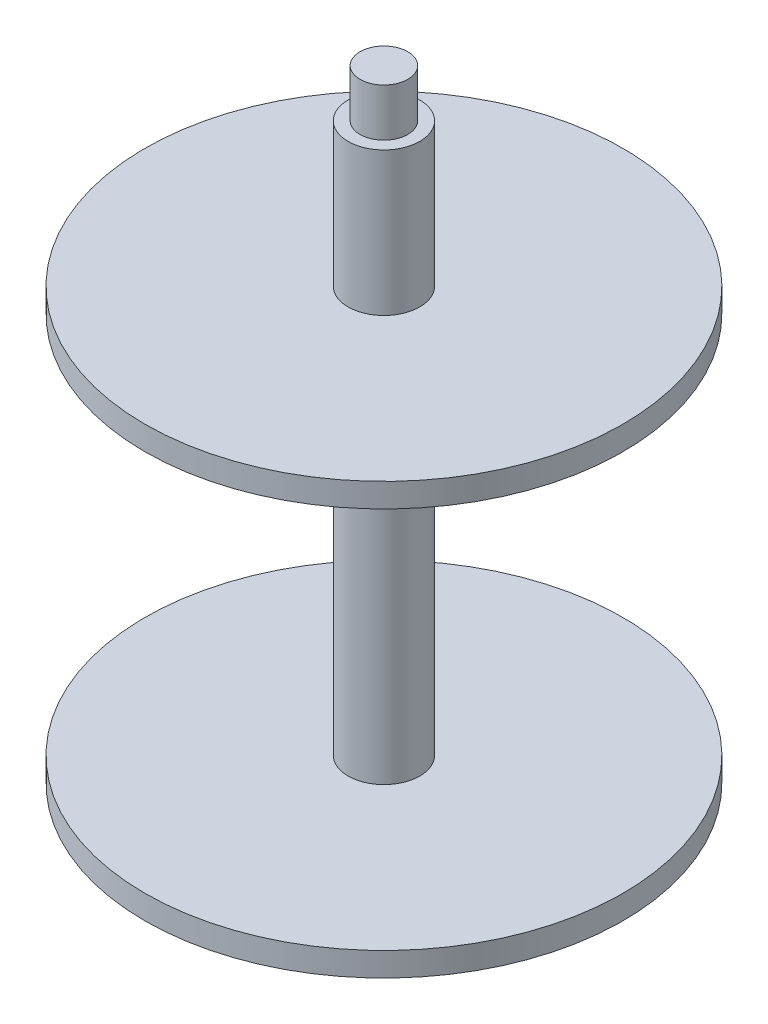
ISO-10303-21;
HEADER;
FILE_DESCRIPTION(('STEP AP214'),'2;1');
FILE_NAME('part.step','',(''),(''),'','','');
FILE_SCHEMA(('AUTOMOTIVE_DESIGN { 1 0 10303 214 1 1 1 1 }'));
ENDSEC;
DATA;
#1=APPLICATION_CONTEXT('core data for automotive mechanical design processes');
#2=APPLICATION_PROTOCOL_DEFINITION('international standard','automotive_design',2000,#1);
#3=PRODUCT_CONTEXT('',#1,'mechanical');
#4=PRODUCT('Part','Part','',(#3));
#5=PRODUCT_RELATED_PRODUCT_CATEGORY('part','',(#4));
#6=PRODUCT_DEFINITION_FORMATION('','',#4);
#7=PRODUCT_DEFINITION_CONTEXT('part definition',#1,'design');
#8=PRODUCT_DEFINITION('design','',#6,#7);
#9=PRODUCT_DEFINITION_SHAPE('','',#8);
#10=(LENGTH_UNIT() NAMED_UNIT(*) SI_UNIT(.MILLI.,.METRE.));
#11=(NAMED_UNIT(*) PLANE_ANGLE_UNIT() SI_UNIT($,.RADIAN.));
#12=(NAMED_UNIT(*) SI_UNIT($,.STERADIAN.) SOLID_ANGLE_UNIT());
#13=UNCERTAINTY_MEASURE_WITH_UNIT(LENGTH_MEASURE(1.E-05),#10,'distance_accuracy_value','');
#14=(GEOMETRIC_REPRESENTATION_CONTEXT(3) GLOBAL_UNCERTAINTY_ASSIGNED_CONTEXT((#13)) GLOBAL_UNIT_ASSIGNED_CONTEXT((#10,
#11,#12)) REPRESENTATION_CONTEXT('',''));
#15=CARTESIAN_POINT('',(0.,0.,0.));
#16=DIRECTION('',(0.,0.,1.));
#17=DIRECTION('',(1.,0.,0.));
#18=AXIS2_PLACEMENT_3D('',#15,#16,#17);
#19=CARTESIAN_POINT('',(0.,160.,0.));
#20=DIRECTION('',(0.,-1.,0.));
#21=DIRECTION('',(0.,0.,-1.));
#22=AXIS2_PLACEMENT_3D('',#19,#20,#21);
#23=CYLINDRICAL_SURFACE('',#22,7.5);
#24=CARTESIAN_POINT('',(0.,120.,0.));
#25=DIRECTION('',(0.,1.,0.));
#26=DIRECTION('',(0.,0.,1.));
#27=AXIS2_PLACEMENT_3D('',#24,#25,#26);
#28=CIRCLE('',#27,7.5);
#29=CARTESIAN_POINT('',(0.,120.,7.5));
#30=VERTEX_POINT('',#29);
#31=EDGE_CURVE('E75',#30,#30,#28,.T.);
#32=ORIENTED_EDGE('',*,*,#31,.T.);
#33=EDGE_LOOP('',(#32));
#34=FACE_BOUND('',#33,.T.);
#35=CARTESIAN_POINT('',(0.,150.,0.));
#36=DIRECTION('',(0.,1.,0.));
#37=DIRECTION('',(0.,0.,1.));
#38=AXIS2_PLACEMENT_3D('',#35,#36,#37);
#39=CIRCLE('',#38,7.5);
#40=CARTESIAN_POINT('',(0.,150.,7.5));
#41=VERTEX_POINT('',#40);
#42=EDGE_CURVE('E82',#41,#41,#39,.T.);
#43=ORIENTED_EDGE('',*,*,#42,.F.);
#44=EDGE_LOOP('',(#43));
#45=FACE_BOUND('',#44,.T.);
#46=ADVANCED_FACE('F39',(#34,#45),#23,.T.);
#47=CARTESIAN_POINT('',(0.,35.,0.));
#48=DIRECTION('',(0.,1.,0.));
#49=DIRECTION('',(0.,0.,1.));
#50=AXIS2_PLACEMENT_3D('',#47,#48,#49);
#51=CIRCLE('',#50,7.5);
#52=CARTESIAN_POINT('',(0.,35.,7.5));
#53=VERTEX_POINT('',#52);
#54=EDGE_CURVE('E56',#53,#53,#51,.T.);
#55=ORIENTED_EDGE('',*,*,#54,.T.);
#56=EDGE_LOOP('',(#55));
#57=FACE_BOUND('',#56,.T.);
#58=CARTESIAN_POINT('',(0.,115.,0.));
#59=DIRECTION('',(0.,1.,0.));
#60=DIRECTION('',(0.,0.,1.));
#61=AXIS2_PLACEMENT_3D('',#58,#59,#60);
#62=CIRCLE('',#61,7.5);
#63=CARTESIAN_POINT('',(0.,115.,7.5));
#64=VERTEX_POINT('',#63);
#65=EDGE_CURVE('E10',#64,#64,#62,.T.);
#66=ORIENTED_EDGE('',*,*,#65,.F.);
#67=EDGE_LOOP('',(#66));
#68=FACE_BOUND('',#67,.T.);
#69=ADVANCED_FACE('F106',(#57,#68),#23,.T.);
#70=CARTESIAN_POINT('',(0.,0.,0.));
#71=DIRECTION('',(0.,1.,0.));
#72=DIRECTION('',(0.,0.,1.));
#73=AXIS2_PLACEMENT_3D('',#70,#71,#72);
#74=CIRCLE('',#73,7.5);
#75=CARTESIAN_POINT('',(0.,0.,7.5));
#76=VERTEX_POINT('',#75);
#77=EDGE_CURVE('E51',#76,#76,#74,.T.);
#78=ORIENTED_EDGE('',*,*,#77,.T.);
#79=EDGE_LOOP('',(#78));
#80=FACE_BOUND('',#79,.T.);
#81=CARTESIAN_POINT('',(0.,30.,0.));
#82=DIRECTION('',(0.,1.,0.));
#83=DIRECTION('',(0.,0.,1.));
#84=AXIS2_PLACEMENT_3D('',#81,#82,#83);
#85=CIRCLE('',#84,7.5);
#86=CARTESIAN_POINT('',(0.,30.,7.5));
#87=VERTEX_POINT('',#86);
#88=EDGE_CURVE('E46',#87,#87,#85,.T.);
#89=ORIENTED_EDGE('',*,*,#88,.F.);
#90=EDGE_LOOP('',(#89));
#91=FACE_BOUND('',#90,.T.);
#92=ADVANCED_FACE('F108',(#80,#91),#23,.T.);
#93=CARTESIAN_POINT('',(0.,0.,0.));
#94=DIRECTION('',(0.,1.,0.));
#95=DIRECTION('',(0.,0.,1.));
#96=AXIS2_PLACEMENT_3D('',#93,#94,#95);
#97=PLANE('',#96);
#98=ORIENTED_EDGE('',*,*,#77,.F.);
#99=EDGE_LOOP('',(#98));
#100=FACE_BOUND('',#99,.T.);
#101=ADVANCED_FACE('F114',(#100),#97,.F.);
#102=CARTESIAN_POINT('',(0.,30.,0.));
#103=DIRECTION('',(0.,1.,0.));
#104=DIRECTION('',(0.,0.,1.));
#105=AXIS2_PLACEMENT_3D('',#102,#103,#104);
#106=CYLINDRICAL_SURFACE('',#105,50.);
#107=CARTESIAN_POINT('',(0.,30.,0.));
#108=DIRECTION('',(0.,1.,0.));
#109=DIRECTION('',(0.,0.,1.));
#110=AXIS2_PLACEMENT_3D('',#107,#108,#109);
#111=CIRCLE('',#110,50.);
#112=CARTESIAN_POINT('',(0.,30.,50.));
#113=VERTEX_POINT('',#112);
#114=EDGE_CURVE('E61',#113,#113,#111,.T.);
#115=ORIENTED_EDGE('',*,*,#114,.T.);
#116=EDGE_LOOP('',(#115));
#117=FACE_BOUND('',#116,.T.);
#118=CARTESIAN_POINT('',(0.,35.,0.));
#119=DIRECTION('',(0.,1.,0.));
#120=DIRECTION('',(0.,0.,1.));
#121=AXIS2_PLACEMENT_3D('',#118,#119,#120);
#122=CIRCLE('',#121,50.);
#123=CARTESIAN_POINT('',(0.,35.,50.));
#124=VERTEX_POINT('',#123);
#125=EDGE_CURVE('E63',#124,#124,#122,.T.);
#126=ORIENTED_EDGE('',*,*,#125,.F.);
#127=EDGE_LOOP('',(#126));
#128=FACE_BOUND('',#127,.T.);
#129=ADVANCED_FACE('F119',(#117,#128),#106,.T.);
#130=CARTESIAN_POINT('',(0.,30.,0.));
#131=DIRECTION('',(0.,1.,0.));
#132=DIRECTION('',(0.,0.,1.));
#133=AXIS2_PLACEMENT_3D('',#130,#131,#132);
#134=PLANE('',#133);
#135=ORIENTED_EDGE('',*,*,#88,.T.);
#136=EDGE_LOOP('',(#135));
#137=FACE_BOUND('',#136,.T.);
#138=ORIENTED_EDGE('',*,*,#114,.F.);
#139=EDGE_LOOP('',(#138));
#140=FACE_BOUND('',#139,.T.);
#141=ADVANCED_FACE('F126',(#137,#140),#134,.F.);
#142=CARTESIAN_POINT('',(0.,35.,0.));
#143=DIRECTION('',(0.,1.,0.));
#144=DIRECTION('',(0.,0.,1.));
#145=AXIS2_PLACEMENT_3D('',#142,#143,#144);
#146=PLANE('',#145);
#147=ORIENTED_EDGE('',*,*,#54,.F.);
#148=EDGE_LOOP('',(#147));
#149=FACE_BOUND('',#148,.T.);
#150=ORIENTED_EDGE('',*,*,#125,.T.);
#151=EDGE_LOOP('',(#150));
#152=FACE_BOUND('',#151,.T.);
#153=ADVANCED_FACE('F134',(#149,#152),#146,.T.);
#154=CARTESIAN_POINT('',(0.,120.,0.));
#155=DIRECTION('',(0.,1.,0.));
#156=DIRECTION('',(0.,0.,1.));
#157=AXIS2_PLACEMENT_3D('',#154,#155,#156);
#158=PLANE('',#157);
#159=CARTESIAN_POINT('',(0.,120.,0.));
#160=DIRECTION('',(0.,1.,0.));
#161=DIRECTION('',(0.,0.,1.));
#162=AXIS2_PLACEMENT_3D('',#159,#160,#161);
#163=CIRCLE('',#162,50.);
#164=CARTESIAN_POINT('',(0.,120.,50.));
#165=VERTEX_POINT('',#164);
#166=EDGE_CURVE('E67',#165,#165,#163,.T.);
#167=ORIENTED_EDGE('',*,*,#166,.T.);
#168=EDGE_LOOP('',(#167));
#169=FACE_BOUND('',#168,.T.);
#170=ORIENTED_EDGE('',*,*,#31,.F.);
#171=EDGE_LOOP('',(#170));
#172=FACE_BOUND('',#171,.T.);
#173=ADVANCED_FACE('F137',(#169,#172),#158,.T.);
#174=CARTESIAN_POINT('',(0.,115.,0.));
#175=DIRECTION('',(0.,1.,0.));
#176=DIRECTION('',(0.,0.,1.));
#177=AXIS2_PLACEMENT_3D('',#174,#175,#176);
#178=PLANE('',#177);
#179=CARTESIAN_POINT('',(0.,115.,0.));
#180=DIRECTION('',(0.,1.,0.));
#181=DIRECTION('',(0.,0.,1.));
#182=AXIS2_PLACEMENT_3D('',#179,#180,#181);
#183=CIRCLE('',#182,50.);
#184=CARTESIAN_POINT('',(0.,115.,50.));
#185=VERTEX_POINT('',#184);
#186=EDGE_CURVE('E71',#185,#185,#183,.T.);
#187=ORIENTED_EDGE('',*,*,#186,.F.);
#188=EDGE_LOOP('',(#187));
#189=FACE_BOUND('',#188,.T.);
#190=ORIENTED_EDGE('',*,*,#65,.T.);
#191=EDGE_LOOP('',(#190));
#192=FACE_BOUND('',#191,.T.);
#193=ADVANCED_FACE('F143',(#189,#192),#178,.F.);
#194=CARTESIAN_POINT('',(0.,120.,0.));
#195=DIRECTION('',(0.,-1.,0.));
#196=DIRECTION('',(0.,0.,-1.));
#197=AXIS2_PLACEMENT_3D('',#194,#195,#196);
#198=CYLINDRICAL_SURFACE('',#197,50.);
#199=ORIENTED_EDGE('',*,*,#166,.F.);
#200=EDGE_LOOP('',(#199));
#201=FACE_BOUND('',#200,.T.);
#202=ORIENTED_EDGE('',*,*,#186,.T.);
#203=EDGE_LOOP('',(#202));
#204=FACE_BOUND('',#203,.T.);
#205=ADVANCED_FACE('F101',(#201,#204),#198,.T.);
#206=CARTESIAN_POINT('',(0.,150.,0.));
#207=DIRECTION('',(0.,1.,0.));
#208=DIRECTION('',(0.,0.,1.));
#209=AXIS2_PLACEMENT_3D('',#206,#207,#208);
#210=PLANE('',#209);
#211=CARTESIAN_POINT('',(0.,150.,0.));
#212=DIRECTION('',(0.,1.,0.));
#213=DIRECTION('',(0.,0.,1.));
#214=AXIS2_PLACEMENT_3D('',#211,#212,#213);
#215=CIRCLE('',#214,5.);
#216=CARTESIAN_POINT('',(0.,150.,5.));
#217=VERTEX_POINT('',#216);
#218=EDGE_CURVE('E86',#217,#217,#215,.T.);
#219=ORIENTED_EDGE('',*,*,#218,.F.);
#220=EDGE_LOOP('',(#219));
#221=FACE_BOUND('',#220,.T.);
#222=ORIENTED_EDGE('',*,*,#42,.T.);
#223=EDGE_LOOP('',(#222));
#224=FACE_BOUND('',#223,.T.);
#225=ADVANCED_FACE('F98',(#221,#224),#210,.T.);
#226=CARTESIAN_POINT('',(0.,150.,0.));
#227=DIRECTION('',(0.,1.,0.));
#228=DIRECTION('',(0.,0.,1.));
#229=AXIS2_PLACEMENT_3D('',#226,#227,#228);
#230=CYLINDRICAL_SURFACE('',#229,5.);
#231=ORIENTED_EDGE('',*,*,#218,.T.);
#232=EDGE_LOOP('',(#231));
#233=FACE_BOUND('',#232,.T.);
#234=CARTESIAN_POINT('',(0.,160.,0.));
#235=DIRECTION('',(0.,1.,0.));
#236=DIRECTION('',(0.,0.,1.));
#237=AXIS2_PLACEMENT_3D('',#234,#235,#236);
#238=CIRCLE('',#237,5.);
#239=CARTESIAN_POINT('',(0.,160.,5.));
#240=VERTEX_POINT('',#239);
#241=EDGE_CURVE('E87',#240,#240,#238,.T.);
#242=ORIENTED_EDGE('',*,*,#241,.F.);
#243=EDGE_LOOP('',(#242));
#244=FACE_BOUND('',#243,.T.);
#245=ADVANCED_FACE('F95',(#233,#244),#230,.T.);
#246=CARTESIAN_POINT('',(0.,160.,0.));
#247=DIRECTION('',(0.,1.,0.));
#248=DIRECTION('',(0.,0.,1.));
#249=AXIS2_PLACEMENT_3D('',#246,#247,#248);
#250=PLANE('',#249);
#251=ORIENTED_EDGE('',*,*,#241,.T.);
#252=EDGE_LOOP('',(#251));
#253=FACE_BOUND('',#252,.T.);
#254=ADVANCED_FACE('F130',(#253),#250,.T.);
#255=CLOSED_SHELL('',(#46,#69,#92,#101,#129,#141,#153,#173,#193,#205,#225,#245,#254));
#256=MANIFOLD_SOLID_BREP('B2',#255);
#257=ADVANCED_BREP_SHAPE_REPRESENTATION('',(#18,#256),#14);
#258=SHAPE_DEFINITION_REPRESENTATION(#9,#257);
ENDSEC;
END-ISO-10303-21;
